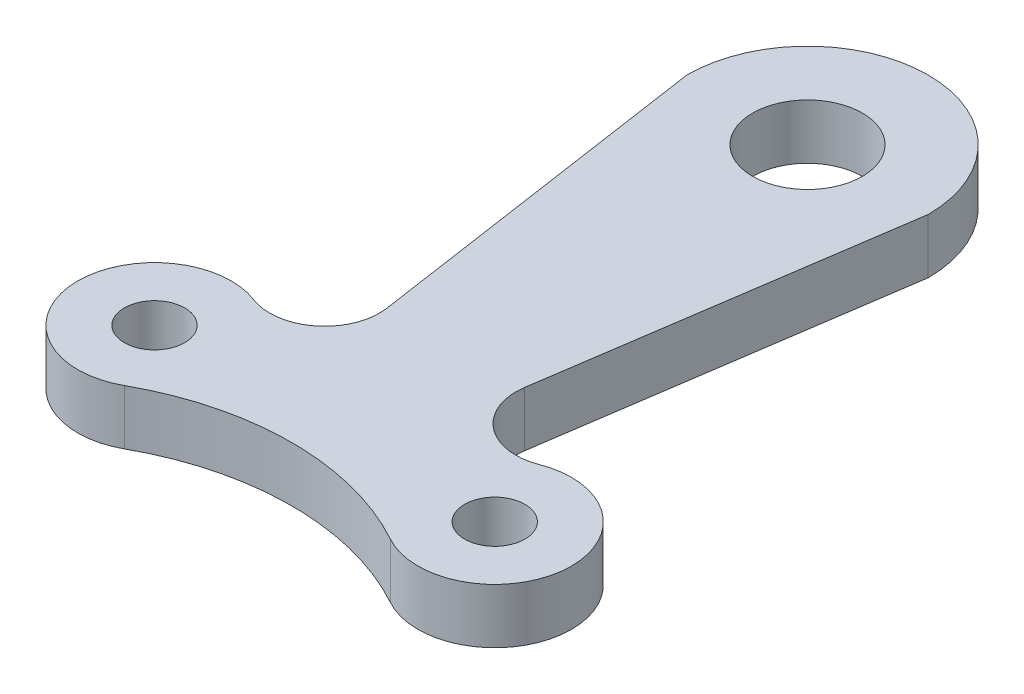
ISO-10303-21;
HEADER;
FILE_DESCRIPTION(('STEP AP214'),'2;1');
FILE_NAME('part.step','',(''),(''),'','','');
FILE_SCHEMA(('AUTOMOTIVE_DESIGN { 1 0 10303 214 1 1 1 1 }'));
ENDSEC;
DATA;
#1=APPLICATION_CONTEXT('core data for automotive mechanical design processes');
#2=APPLICATION_PROTOCOL_DEFINITION('international standard','automotive_design',2000,#1);
#3=PRODUCT_CONTEXT('',#1,'mechanical');
#4=PRODUCT('Part','Part','',(#3));
#5=PRODUCT_RELATED_PRODUCT_CATEGORY('part','',(#4));
#6=PRODUCT_DEFINITION_FORMATION('','',#4);
#7=PRODUCT_DEFINITION_CONTEXT('part definition',#1,'design');
#8=PRODUCT_DEFINITION('design','',#6,#7);
#9=PRODUCT_DEFINITION_SHAPE('','',#8);
#10=(LENGTH_UNIT() NAMED_UNIT(*) SI_UNIT(.MILLI.,.METRE.));
#11=(NAMED_UNIT(*) PLANE_ANGLE_UNIT() SI_UNIT($,.RADIAN.));
#12=(NAMED_UNIT(*) SI_UNIT($,.STERADIAN.) SOLID_ANGLE_UNIT());
#13=UNCERTAINTY_MEASURE_WITH_UNIT(LENGTH_MEASURE(1.E-05),#10,'distance_accuracy_value','');
#14=(GEOMETRIC_REPRESENTATION_CONTEXT(3) GLOBAL_UNCERTAINTY_ASSIGNED_CONTEXT((#13)) GLOBAL_UNIT_ASSIGNED_CONTEXT((#10,
#11,#12)) REPRESENTATION_CONTEXT('',''));
#15=CARTESIAN_POINT('',(0.,0.,0.));
#16=DIRECTION('',(0.,0.,1.));
#17=DIRECTION('',(1.,0.,0.));
#18=AXIS2_PLACEMENT_3D('',#15,#16,#17);
#19=CARTESIAN_POINT('',(0.0017685398693585,10.,143.990091510913));
#20=DIRECTION('',(0.,1.,0.));
#21=DIRECTION('',(0.,0.,1.));
#22=AXIS2_PLACEMENT_3D('',#19,#20,#21);
#23=PLANE('',#22);
#24=CARTESIAN_POINT('',(31.,10.,88.));
#25=DIRECTION('',(0.,1.,0.));
#26=DIRECTION('',(0.,0.,1.));
#27=AXIS2_PLACEMENT_3D('',#24,#25,#26);
#28=CIRCLE('',#27,5.5);
#29=CARTESIAN_POINT('',(31.,10.,93.5));
#30=VERTEX_POINT('',#29);
#31=EDGE_CURVE('E213',#30,#30,#28,.T.);
#32=ORIENTED_EDGE('',*,*,#31,.F.);
#33=EDGE_LOOP('',(#32));
#34=FACE_BOUND('',#33,.T.);
#35=CARTESIAN_POINT('',(0.0017685398693585,10.,143.990091510913));
#36=DIRECTION('',(0.,-1.,0.));
#37=DIRECTION('',(0.,0.,1.));
#38=AXIS2_PLACEMENT_3D('',#35,#36,#37);
#39=CIRCLE('',#38,50.);
#40=CARTESIAN_POINT('',(-24.2183631319036,10.,100.247832518012));
#41=VERTEX_POINT('',#40);
#42=CARTESIAN_POINT('',(24.2197851904306,10.,100.246661495502));
#43=VERTEX_POINT('',#42);
#44=EDGE_CURVE('E164',#41,#43,#39,.T.);
#45=ORIENTED_EDGE('',*,*,#44,.T.);
#46=CARTESIAN_POINT('',(31.,10.,88.));
#47=DIRECTION('',(0.,1.,0.));
#48=DIRECTION('',(0.,0.,1.));
#49=AXIS2_PLACEMENT_3D('',#46,#47,#48);
#50=CIRCLE('',#49,13.9982867040689);
#51=CARTESIAN_POINT('',(25.994886361531,10.,74.9270941212245));
#52=VERTEX_POINT('',#51);
#53=EDGE_CURVE('E100',#43,#52,#50,.T.);
#54=ORIENTED_EDGE('',*,*,#53,.T.);
#55=CARTESIAN_POINT('',(22.4193676253601,10.,65.5881613252734));
#56=DIRECTION('',(0.,-1.,0.));
#57=DIRECTION('',(0.,0.,1.));
#58=AXIS2_PLACEMENT_3D('',#55,#56,#57);
#59=CIRCLE('',#58,9.99999999999998);
#60=CARTESIAN_POINT('',(12.5267302631838,10.,64.1267489876792));
#61=VERTEX_POINT('',#60);
#62=EDGE_CURVE('E185',#52,#61,#59,.T.);
#63=ORIENTED_EDGE('',*,*,#62,.T.);
#64=DIRECTION('',(0.146141233759423,0.,-0.989263736217635));
#65=VECTOR('',#64,1.);
#66=CARTESIAN_POINT('',(22.,10.,0.));
#67=LINE('',#66,#65);
#68=CARTESIAN_POINT('',(22.,10.,0.));
#69=VERTEX_POINT('',#68);
#70=EDGE_CURVE('E199',#61,#69,#67,.T.);
#71=ORIENTED_EDGE('',*,*,#70,.T.);
#72=CARTESIAN_POINT('',(0.,10.,0.));
#73=DIRECTION('',(0.,1.,0.));
#74=DIRECTION('',(0.,0.,1.));
#75=AXIS2_PLACEMENT_3D('',#72,#73,#74);
#76=CIRCLE('',#75,22.);
#77=CARTESIAN_POINT('',(-22.,10.,0.));
#78=VERTEX_POINT('',#77);
#79=EDGE_CURVE('E119',#69,#78,#76,.T.);
#80=ORIENTED_EDGE('',*,*,#79,.T.);
#81=DIRECTION('',(0.146141233759423,0.,0.989263736217634));
#82=VECTOR('',#81,1.);
#83=CARTESIAN_POINT('',(-22.,10.,0.));
#84=LINE('',#83,#82);
#85=CARTESIAN_POINT('',(-12.5270175238812,10.,64.1248044537272));
#86=VERTEX_POINT('',#85);
#87=EDGE_CURVE('E113',#78,#86,#84,.T.);
#88=ORIENTED_EDGE('',*,*,#87,.T.);
#89=CARTESIAN_POINT('',(-22.4196548860576,10.,65.5862167913214));
#90=DIRECTION('',(0.,-1.,0.));
#91=DIRECTION('',(0.,0.,1.));
#92=AXIS2_PLACEMENT_3D('',#89,#90,#91);
#93=CIRCLE('',#92,9.99999999999999);
#94=CARTESIAN_POINT('',(-25.9947986835336,10.,74.9252931282708));
#95=VERTEX_POINT('',#94);
#96=EDGE_CURVE('E117',#86,#95,#93,.T.);
#97=ORIENTED_EDGE('',*,*,#96,.T.);
#98=CARTESIAN_POINT('',(-31.,10.,88.));
#99=DIRECTION('',(0.,1.,0.));
#100=DIRECTION('',(0.,0.,1.));
#101=AXIS2_PLACEMENT_3D('',#98,#99,#100);
#102=CIRCLE('',#101,14.);
#103=EDGE_CURVE('E57',#95,#41,#102,.T.);
#104=ORIENTED_EDGE('',*,*,#103,.T.);
#105=EDGE_LOOP('',(#45,#54,#63,#71,#80,#88,#97,#104));
#106=FACE_BOUND('',#105,.T.);
#107=CARTESIAN_POINT('',(0.,10.,0.));
#108=DIRECTION('',(0.,1.,0.));
#109=DIRECTION('',(0.,0.,1.));
#110=AXIS2_PLACEMENT_3D('',#107,#108,#109);
#111=CIRCLE('',#110,10.);
#112=CARTESIAN_POINT('',(0.,10.,10.));
#113=VERTEX_POINT('',#112);
#114=EDGE_CURVE('E146',#113,#113,#111,.T.);
#115=ORIENTED_EDGE('',*,*,#114,.F.);
#116=EDGE_LOOP('',(#115));
#117=FACE_BOUND('',#116,.T.);
#118=CARTESIAN_POINT('',(-31.,10.,88.));
#119=DIRECTION('',(0.,1.,0.));
#120=DIRECTION('',(0.,0.,-1.));
#121=AXIS2_PLACEMENT_3D('',#118,#119,#120);
#122=CIRCLE('',#121,5.5);
#123=CARTESIAN_POINT('',(-31.,10.,82.5));
#124=VERTEX_POINT('',#123);
#125=EDGE_CURVE('E221',#124,#124,#122,.T.);
#126=ORIENTED_EDGE('',*,*,#125,.F.);
#127=EDGE_LOOP('',(#126));
#128=FACE_BOUND('',#127,.T.);
#129=ADVANCED_FACE('F39',(#34,#106,#117,#128),#23,.T.);
#130=CARTESIAN_POINT('',(0.0017685398693585,0.,143.990091510913));
#131=DIRECTION('',(0.,1.,0.));
#132=DIRECTION('',(0.,0.,1.));
#133=AXIS2_PLACEMENT_3D('',#130,#131,#132);
#134=PLANE('',#133);
#135=CARTESIAN_POINT('',(0.0017685398693585,0.,143.990091510913));
#136=DIRECTION('',(0.,-1.,0.));
#137=DIRECTION('',(0.,0.,1.));
#138=AXIS2_PLACEMENT_3D('',#135,#136,#137);
#139=CIRCLE('',#138,50.);
#140=CARTESIAN_POINT('',(-24.2183631319036,0.,100.247832518012));
#141=VERTEX_POINT('',#140);
#142=CARTESIAN_POINT('',(24.2197851904306,0.,100.246661495502));
#143=VERTEX_POINT('',#142);
#144=EDGE_CURVE('E141',#141,#143,#139,.T.);
#145=ORIENTED_EDGE('',*,*,#144,.F.);
#146=CARTESIAN_POINT('',(-31.,0.,88.));
#147=DIRECTION('',(0.,1.,0.));
#148=DIRECTION('',(0.,0.,1.));
#149=AXIS2_PLACEMENT_3D('',#146,#147,#148);
#150=CIRCLE('',#149,14.);
#151=CARTESIAN_POINT('',(-25.9947986835336,0.,74.9252931282708));
#152=VERTEX_POINT('',#151);
#153=EDGE_CURVE('E92',#152,#141,#150,.T.);
#154=ORIENTED_EDGE('',*,*,#153,.F.);
#155=CARTESIAN_POINT('',(-22.4196548860576,0.,65.5862167913214));
#156=DIRECTION('',(0.,-1.,0.));
#157=DIRECTION('',(0.,0.,1.));
#158=AXIS2_PLACEMENT_3D('',#155,#156,#157);
#159=CIRCLE('',#158,9.99999999999999);
#160=CARTESIAN_POINT('',(-12.5270175238812,0.,64.1248044537272));
#161=VERTEX_POINT('',#160);
#162=EDGE_CURVE('E86',#161,#152,#159,.T.);
#163=ORIENTED_EDGE('',*,*,#162,.F.);
#164=DIRECTION('',(0.146141233759423,0.,0.989263736217634));
#165=VECTOR('',#164,1.);
#166=CARTESIAN_POINT('',(-22.,0.,0.));
#167=LINE('',#166,#165);
#168=CARTESIAN_POINT('',(-22.,0.,0.));
#169=VERTEX_POINT('',#168);
#170=EDGE_CURVE('E128',#169,#161,#167,.T.);
#171=ORIENTED_EDGE('',*,*,#170,.F.);
#172=CARTESIAN_POINT('',(0.,0.,0.));
#173=DIRECTION('',(0.,1.,0.));
#174=DIRECTION('',(0.,0.,1.));
#175=AXIS2_PLACEMENT_3D('',#172,#173,#174);
#176=CIRCLE('',#175,22.);
#177=CARTESIAN_POINT('',(22.,0.,0.));
#178=VERTEX_POINT('',#177);
#179=EDGE_CURVE('E155',#178,#169,#176,.T.);
#180=ORIENTED_EDGE('',*,*,#179,.F.);
#181=DIRECTION('',(0.146141233759423,0.,-0.989263736217635));
#182=VECTOR('',#181,1.);
#183=CARTESIAN_POINT('',(22.,0.,0.));
#184=LINE('',#183,#182);
#185=CARTESIAN_POINT('',(12.5267302631838,0.,64.1267489876792));
#186=VERTEX_POINT('',#185);
#187=EDGE_CURVE('E152',#186,#178,#184,.T.);
#188=ORIENTED_EDGE('',*,*,#187,.F.);
#189=CARTESIAN_POINT('',(22.4193676253601,0.,65.5881613252734));
#190=DIRECTION('',(0.,-1.,0.));
#191=DIRECTION('',(0.,0.,1.));
#192=AXIS2_PLACEMENT_3D('',#189,#190,#191);
#193=CIRCLE('',#192,9.99999999999998);
#194=CARTESIAN_POINT('',(25.994886361531,0.,74.9270941212245));
#195=VERTEX_POINT('',#194);
#196=EDGE_CURVE('E149',#195,#186,#193,.T.);
#197=ORIENTED_EDGE('',*,*,#196,.F.);
#198=CARTESIAN_POINT('',(31.,0.,88.));
#199=DIRECTION('',(0.,1.,0.));
#200=DIRECTION('',(0.,0.,1.));
#201=AXIS2_PLACEMENT_3D('',#198,#199,#200);
#202=CIRCLE('',#201,13.9982867040689);
#203=EDGE_CURVE('E145',#143,#195,#202,.T.);
#204=ORIENTED_EDGE('',*,*,#203,.F.);
#205=EDGE_LOOP('',(#145,#154,#163,#171,#180,#188,#197,#204));
#206=FACE_BOUND('',#205,.T.);
#207=CARTESIAN_POINT('',(0.,0.,0.));
#208=DIRECTION('',(0.,1.,0.));
#209=DIRECTION('',(0.,0.,1.));
#210=AXIS2_PLACEMENT_3D('',#207,#208,#209);
#211=CIRCLE('',#210,10.);
#212=CARTESIAN_POINT('',(0.,0.,10.));
#213=VERTEX_POINT('',#212);
#214=EDGE_CURVE('E209',#213,#213,#211,.T.);
#215=ORIENTED_EDGE('',*,*,#214,.T.);
#216=EDGE_LOOP('',(#215));
#217=FACE_BOUND('',#216,.T.);
#218=CARTESIAN_POINT('',(31.,0.,88.));
#219=DIRECTION('',(0.,1.,0.));
#220=DIRECTION('',(0.,0.,1.));
#221=AXIS2_PLACEMENT_3D('',#218,#219,#220);
#222=CIRCLE('',#221,5.5);
#223=CARTESIAN_POINT('',(31.,0.,93.5));
#224=VERTEX_POINT('',#223);
#225=EDGE_CURVE('E217',#224,#224,#222,.T.);
#226=ORIENTED_EDGE('',*,*,#225,.T.);
#227=EDGE_LOOP('',(#226));
#228=FACE_BOUND('',#227,.T.);
#229=CARTESIAN_POINT('',(-31.,0.,88.));
#230=DIRECTION('',(0.,1.,0.));
#231=DIRECTION('',(0.,0.,-1.));
#232=AXIS2_PLACEMENT_3D('',#229,#230,#231);
#233=CIRCLE('',#232,5.5);
#234=CARTESIAN_POINT('',(-31.,0.,82.5));
#235=VERTEX_POINT('',#234);
#236=EDGE_CURVE('E225',#235,#235,#233,.T.);
#237=ORIENTED_EDGE('',*,*,#236,.T.);
#238=EDGE_LOOP('',(#237));
#239=FACE_BOUND('',#238,.T.);
#240=ADVANCED_FACE('F189',(#206,#217,#228,#239),#134,.F.);
#241=CARTESIAN_POINT('',(0.0017685398693585,10.,143.990091510913));
#242=DIRECTION('',(0.,-1.,0.));
#243=DIRECTION('',(0.,0.,-1.));
#244=AXIS2_PLACEMENT_3D('',#241,#242,#243);
#245=CYLINDRICAL_SURFACE('',#244,50.);
#246=ORIENTED_EDGE('',*,*,#144,.T.);
#247=DIRECTION('',(0.,-1.,0.));
#248=VECTOR('',#247,1.);
#249=CARTESIAN_POINT('',(24.2197851904306,10.,100.246661495502));
#250=LINE('',#249,#248);
#251=EDGE_CURVE('E11',#43,#143,#250,.T.);
#252=ORIENTED_EDGE('',*,*,#251,.F.);
#253=ORIENTED_EDGE('',*,*,#44,.F.);
#254=DIRECTION('',(0.,-1.,0.));
#255=VECTOR('',#254,1.);
#256=CARTESIAN_POINT('',(-24.2183631319036,10.,100.247832518012));
#257=LINE('',#256,#255);
#258=EDGE_CURVE('E137',#41,#141,#257,.T.);
#259=ORIENTED_EDGE('',*,*,#258,.T.);
#260=EDGE_LOOP('',(#246,#252,#253,#259));
#261=FACE_BOUND('',#260,.T.);
#262=ADVANCED_FACE('F41',(#261),#245,.F.);
#263=CARTESIAN_POINT('',(31.,10.,88.));
#264=DIRECTION('',(0.,-1.,0.));
#265=DIRECTION('',(0.,0.,-1.));
#266=AXIS2_PLACEMENT_3D('',#263,#264,#265);
#267=CYLINDRICAL_SURFACE('',#266,13.9982867040689);
#268=ORIENTED_EDGE('',*,*,#203,.T.);
#269=DIRECTION('',(0.,-1.,0.));
#270=VECTOR('',#269,1.);
#271=CARTESIAN_POINT('',(25.994886361531,10.,74.9270941212245));
#272=LINE('',#271,#270);
#273=EDGE_CURVE('E49',#52,#195,#272,.T.);
#274=ORIENTED_EDGE('',*,*,#273,.F.);
#275=ORIENTED_EDGE('',*,*,#53,.F.);
#276=ORIENTED_EDGE('',*,*,#251,.T.);
#277=EDGE_LOOP('',(#268,#274,#275,#276));
#278=FACE_BOUND('',#277,.T.);
#279=ADVANCED_FACE('F260',(#278),#267,.T.);
#280=CARTESIAN_POINT('',(22.4193676253601,10.,65.5881613252734));
#281=DIRECTION('',(0.,-1.,0.));
#282=DIRECTION('',(0.,0.,-1.));
#283=AXIS2_PLACEMENT_3D('',#280,#281,#282);
#284=CYLINDRICAL_SURFACE('',#283,9.99999999999998);
#285=ORIENTED_EDGE('',*,*,#196,.T.);
#286=DIRECTION('',(0.,-1.,0.));
#287=VECTOR('',#286,1.);
#288=CARTESIAN_POINT('',(12.5267302631838,10.,64.1267489876792));
#289=LINE('',#288,#287);
#290=EDGE_CURVE('E175',#61,#186,#289,.T.);
#291=ORIENTED_EDGE('',*,*,#290,.F.);
#292=ORIENTED_EDGE('',*,*,#62,.F.);
#293=ORIENTED_EDGE('',*,*,#273,.T.);
#294=EDGE_LOOP('',(#285,#291,#292,#293));
#295=FACE_BOUND('',#294,.T.);
#296=ADVANCED_FACE('F183',(#295),#284,.F.);
#297=CARTESIAN_POINT('',(22.,10.,0.));
#298=DIRECTION('',(-0.989263736217635,0.,-0.146141233759423));
#299=DIRECTION('',(-0.146141233759423,0.,0.989263736217635));
#300=AXIS2_PLACEMENT_3D('',#297,#298,#299);
#301=PLANE('',#300);
#302=ORIENTED_EDGE('',*,*,#187,.T.);
#303=DIRECTION('',(0.,-1.,0.));
#304=VECTOR('',#303,1.);
#305=CARTESIAN_POINT('',(22.,10.,0.));
#306=LINE('',#305,#304);
#307=EDGE_CURVE('E171',#69,#178,#306,.T.);
#308=ORIENTED_EDGE('',*,*,#307,.F.);
#309=ORIENTED_EDGE('',*,*,#70,.F.);
#310=ORIENTED_EDGE('',*,*,#290,.T.);
#311=EDGE_LOOP('',(#302,#308,#309,#310));
#312=FACE_BOUND('',#311,.T.);
#313=ADVANCED_FACE('F194',(#312),#301,.F.);
#314=CARTESIAN_POINT('',(0.,10.,0.));
#315=DIRECTION('',(0.,-1.,0.));
#316=DIRECTION('',(0.,0.,-1.));
#317=AXIS2_PLACEMENT_3D('',#314,#315,#316);
#318=CYLINDRICAL_SURFACE('',#317,22.);
#319=ORIENTED_EDGE('',*,*,#179,.T.);
#320=DIRECTION('',(0.,-1.,0.));
#321=VECTOR('',#320,1.);
#322=CARTESIAN_POINT('',(-22.,10.,0.));
#323=LINE('',#322,#321);
#324=EDGE_CURVE('E130',#78,#169,#323,.T.);
#325=ORIENTED_EDGE('',*,*,#324,.F.);
#326=ORIENTED_EDGE('',*,*,#79,.F.);
#327=ORIENTED_EDGE('',*,*,#307,.T.);
#328=EDGE_LOOP('',(#319,#325,#326,#327));
#329=FACE_BOUND('',#328,.T.);
#330=ADVANCED_FACE('F197',(#329),#318,.T.);
#331=CARTESIAN_POINT('',(-22.,10.,0.));
#332=DIRECTION('',(0.989263736217635,0.,-0.146141233759423));
#333=DIRECTION('',(-0.146141233759423,0.,-0.989263736217635));
#334=AXIS2_PLACEMENT_3D('',#331,#332,#333);
#335=PLANE('',#334);
#336=ORIENTED_EDGE('',*,*,#170,.T.);
#337=DIRECTION('',(0.,-1.,0.));
#338=VECTOR('',#337,1.);
#339=CARTESIAN_POINT('',(-12.5270175238812,10.,64.1248044537272));
#340=LINE('',#339,#338);
#341=EDGE_CURVE('E125',#86,#161,#340,.T.);
#342=ORIENTED_EDGE('',*,*,#341,.F.);
#343=ORIENTED_EDGE('',*,*,#87,.F.);
#344=ORIENTED_EDGE('',*,*,#324,.T.);
#345=EDGE_LOOP('',(#336,#342,#343,#344));
#346=FACE_BOUND('',#345,.T.);
#347=ADVANCED_FACE('F126',(#346),#335,.F.);
#348=CARTESIAN_POINT('',(-22.4196548860576,10.,65.5862167913214));
#349=DIRECTION('',(0.,-1.,0.));
#350=DIRECTION('',(0.,0.,-1.));
#351=AXIS2_PLACEMENT_3D('',#348,#349,#350);
#352=CYLINDRICAL_SURFACE('',#351,9.99999999999999);
#353=ORIENTED_EDGE('',*,*,#162,.T.);
#354=DIRECTION('',(0.,-1.,0.));
#355=VECTOR('',#354,1.);
#356=CARTESIAN_POINT('',(-25.9947986835336,10.,74.9252931282708));
#357=LINE('',#356,#355);
#358=EDGE_CURVE('E131',#95,#152,#357,.T.);
#359=ORIENTED_EDGE('',*,*,#358,.F.);
#360=ORIENTED_EDGE('',*,*,#96,.F.);
#361=ORIENTED_EDGE('',*,*,#341,.T.);
#362=EDGE_LOOP('',(#353,#359,#360,#361));
#363=FACE_BOUND('',#362,.T.);
#364=ADVANCED_FACE('F133',(#363),#352,.F.);
#365=CARTESIAN_POINT('',(-31.,10.,88.));
#366=DIRECTION('',(0.,-1.,0.));
#367=DIRECTION('',(0.,0.,-1.));
#368=AXIS2_PLACEMENT_3D('',#365,#366,#367);
#369=CYLINDRICAL_SURFACE('',#368,14.);
#370=ORIENTED_EDGE('',*,*,#153,.T.);
#371=ORIENTED_EDGE('',*,*,#258,.F.);
#372=ORIENTED_EDGE('',*,*,#103,.F.);
#373=ORIENTED_EDGE('',*,*,#358,.T.);
#374=EDGE_LOOP('',(#370,#371,#372,#373));
#375=FACE_BOUND('',#374,.T.);
#376=ADVANCED_FACE('F248',(#375),#369,.T.);
#377=CARTESIAN_POINT('',(0.,10.,0.));
#378=DIRECTION('',(0.,-1.,0.));
#379=DIRECTION('',(0.,0.,-1.));
#380=AXIS2_PLACEMENT_3D('',#377,#378,#379);
#381=CYLINDRICAL_SURFACE('',#380,10.);
#382=ORIENTED_EDGE('',*,*,#114,.T.);
#383=EDGE_LOOP('',(#382));
#384=FACE_BOUND('',#383,.T.);
#385=ORIENTED_EDGE('',*,*,#214,.F.);
#386=EDGE_LOOP('',(#385));
#387=FACE_BOUND('',#386,.T.);
#388=ADVANCED_FACE('F245',(#384,#387),#381,.F.);
#389=CARTESIAN_POINT('',(31.,10.,88.));
#390=DIRECTION('',(0.,-1.,0.));
#391=DIRECTION('',(0.,0.,-1.));
#392=AXIS2_PLACEMENT_3D('',#389,#390,#391);
#393=CYLINDRICAL_SURFACE('',#392,5.5);
#394=ORIENTED_EDGE('',*,*,#31,.T.);
#395=EDGE_LOOP('',(#394));
#396=FACE_BOUND('',#395,.T.);
#397=ORIENTED_EDGE('',*,*,#225,.F.);
#398=EDGE_LOOP('',(#397));
#399=FACE_BOUND('',#398,.T.);
#400=ADVANCED_FACE('F324',(#396,#399),#393,.F.);
#401=CARTESIAN_POINT('',(-31.,10.,88.));
#402=DIRECTION('',(0.,-1.,0.));
#403=DIRECTION('',(0.,0.,-1.));
#404=AXIS2_PLACEMENT_3D('',#401,#402,#403);
#405=CYLINDRICAL_SURFACE('',#404,5.5);
#406=ORIENTED_EDGE('',*,*,#125,.T.);
#407=EDGE_LOOP('',(#406));
#408=FACE_BOUND('',#407,.T.);
#409=ORIENTED_EDGE('',*,*,#236,.F.);
#410=EDGE_LOOP('',(#409));
#411=FACE_BOUND('',#410,.T.);
#412=ADVANCED_FACE('F233',(#408,#411),#405,.F.);
#413=CLOSED_SHELL('',(#129,#240,#262,#279,#296,#313,#330,#347,#364,#376,#388,#400,#412));
#414=MANIFOLD_SOLID_BREP('B2',#413);
#415=ADVANCED_BREP_SHAPE_REPRESENTATION('',(#18,#414),#14);
#416=SHAPE_DEFINITION_REPRESENTATION(#9,#415);
ENDSEC;
END-ISO-10303-21;
